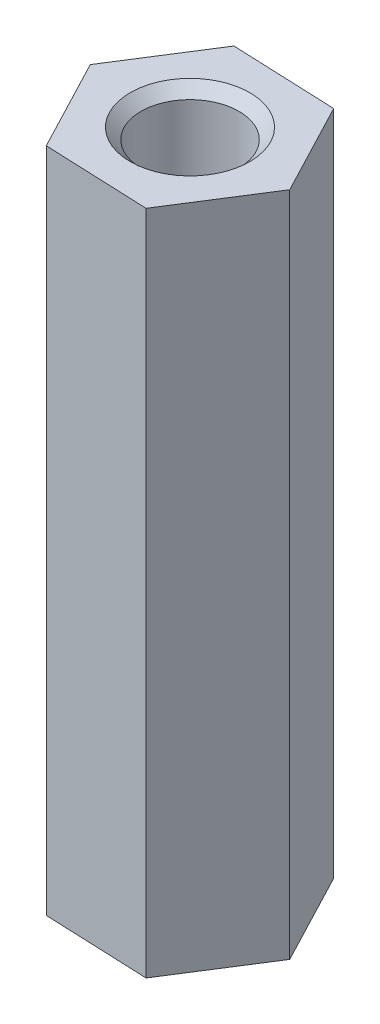
ISO-10303-21;
HEADER;
FILE_DESCRIPTION(('STEP AP214'),'2;1');
FILE_NAME('part.step','',(''),(''),'','','');
FILE_SCHEMA(('AUTOMOTIVE_DESIGN { 1 0 10303 214 1 1 1 1 }'));
ENDSEC;
DATA;
#1=APPLICATION_CONTEXT('core data for automotive mechanical design processes');
#2=APPLICATION_PROTOCOL_DEFINITION('international standard','automotive_design',2000,#1);
#3=PRODUCT_CONTEXT('',#1,'mechanical');
#4=PRODUCT('Part','Part','',(#3));
#5=PRODUCT_RELATED_PRODUCT_CATEGORY('part','',(#4));
#6=PRODUCT_DEFINITION_FORMATION('','',#4);
#7=PRODUCT_DEFINITION_CONTEXT('part definition',#1,'design');
#8=PRODUCT_DEFINITION('design','',#6,#7);
#9=PRODUCT_DEFINITION_SHAPE('','',#8);
#10=(LENGTH_UNIT() NAMED_UNIT(*) SI_UNIT(.MILLI.,.METRE.));
#11=(NAMED_UNIT(*) PLANE_ANGLE_UNIT() SI_UNIT($,.RADIAN.));
#12=(NAMED_UNIT(*) SI_UNIT($,.STERADIAN.) SOLID_ANGLE_UNIT());
#13=UNCERTAINTY_MEASURE_WITH_UNIT(LENGTH_MEASURE(1.E-05),#10,'distance_accuracy_value','');
#14=(GEOMETRIC_REPRESENTATION_CONTEXT(3) GLOBAL_UNCERTAINTY_ASSIGNED_CONTEXT((#13)) GLOBAL_UNIT_ASSIGNED_CONTEXT((#10,
#11,#12)) REPRESENTATION_CONTEXT('',''));
#15=CARTESIAN_POINT('',(0.,0.,0.));
#16=DIRECTION('',(0.,0.,1.));
#17=DIRECTION('',(1.,0.,0.));
#18=AXIS2_PLACEMENT_3D('',#15,#16,#17);
#19=CARTESIAN_POINT('',(0.,17.,0.));
#20=DIRECTION('',(0.,1.,0.));
#21=DIRECTION('',(0.,0.,1.));
#22=AXIS2_PLACEMENT_3D('',#19,#20,#21);
#23=PLANE('',#22);
#24=CARTESIAN_POINT('',(0.,17.,0.));
#25=DIRECTION('',(0.,1.,0.));
#26=DIRECTION('',(0.,0.,1.));
#27=AXIS2_PLACEMENT_3D('',#24,#25,#26);
#28=CIRCLE('',#27,1.525);
#29=CARTESIAN_POINT('',(0.,17.,1.525));
#30=VERTEX_POINT('',#29);
#31=EDGE_CURVE('E177',#30,#30,#28,.T.);
#32=ORIENTED_EDGE('',*,*,#31,.F.);
#33=EDGE_LOOP('',(#32));
#34=FACE_BOUND('',#33,.T.);
#35=DIRECTION('',(0.999145776971958,0.,0.0413245249107971));
#36=VECTOR('',#35,1.);
#37=CARTESIAN_POINT('',(-1.42181769887204,17.,2.24316021819832));
#38=LINE('',#37,#36);
#39=CARTESIAN_POINT('',(-1.42181769887204,17.,2.24316021819832));
#40=VERTEX_POINT('',#39);
#41=CARTESIAN_POINT('',(1.23172488428237,17.,2.35291035587268));
#42=VERTEX_POINT('',#41);
#43=EDGE_CURVE('E133',#40,#42,#38,.T.);
#44=ORIENTED_EDGE('',*,*,#43,.T.);
#45=DIRECTION('',(0.535360976858052,0.,-0.844623362486258));
#46=VECTOR('',#45,1.);
#47=CARTESIAN_POINT('',(1.23172488428237,17.,2.35291035587268));
#48=LINE('',#47,#46);
#49=CARTESIAN_POINT('',(2.65354258315441,17.,0.109750137674357));
#50=VERTEX_POINT('',#49);
#51=EDGE_CURVE('E92',#42,#50,#48,.T.);
#52=ORIENTED_EDGE('',*,*,#51,.T.);
#53=DIRECTION('',(-0.463784800113906,0.,-0.885947887397055));
#54=VECTOR('',#53,1.);
#55=CARTESIAN_POINT('',(2.65354258315441,17.,0.109750137674357));
#56=LINE('',#55,#54);
#57=CARTESIAN_POINT('',(1.42181769887204,17.,-2.24316021819832));
#58=VERTEX_POINT('',#57);
#59=EDGE_CURVE('E104',#50,#58,#56,.T.);
#60=ORIENTED_EDGE('',*,*,#59,.T.);
#61=DIRECTION('',(-0.999145776971957,0.,-0.0413245249107969));
#62=VECTOR('',#61,1.);
#63=CARTESIAN_POINT('',(1.42181769887204,17.,-2.24316021819832));
#64=LINE('',#63,#62);
#65=CARTESIAN_POINT('',(-1.23172488428237,17.,-2.35291035587268));
#66=VERTEX_POINT('',#65);
#67=EDGE_CURVE('E99',#58,#66,#64,.T.);
#68=ORIENTED_EDGE('',*,*,#67,.T.);
#69=DIRECTION('',(-0.535360976858052,0.,0.844623362486258));
#70=VECTOR('',#69,1.);
#71=CARTESIAN_POINT('',(-1.23172488428237,17.,-2.35291035587268));
#72=LINE('',#71,#70);
#73=CARTESIAN_POINT('',(-2.65354258315441,17.,-0.109750137674357));
#74=VERTEX_POINT('',#73);
#75=EDGE_CURVE('E102',#66,#74,#72,.T.);
#76=ORIENTED_EDGE('',*,*,#75,.T.);
#77=DIRECTION('',(0.463784800113906,0.,0.885947887397055));
#78=VECTOR('',#77,1.);
#79=CARTESIAN_POINT('',(-2.65354258315441,17.,-0.109750137674357));
#80=LINE('',#79,#78);
#81=EDGE_CURVE('E55',#74,#40,#80,.T.);
#82=ORIENTED_EDGE('',*,*,#81,.T.);
#83=EDGE_LOOP('',(#44,#52,#60,#68,#76,#82));
#84=FACE_BOUND('',#83,.T.);
#85=ADVANCED_FACE('F38',(#34,#84),#23,.T.);
#86=CARTESIAN_POINT('',(0.,0.,0.));
#87=DIRECTION('',(0.,1.,0.));
#88=DIRECTION('',(0.,0.,1.));
#89=AXIS2_PLACEMENT_3D('',#86,#87,#88);
#90=PLANE('',#89);
#91=CARTESIAN_POINT('',(0.,0.,0.));
#92=DIRECTION('',(0.,1.,0.));
#93=DIRECTION('',(0.,0.,1.));
#94=AXIS2_PLACEMENT_3D('',#91,#92,#93);
#95=CIRCLE('',#94,1.25);
#96=CARTESIAN_POINT('',(0.,0.,1.25));
#97=VERTEX_POINT('',#96);
#98=EDGE_CURVE('E126',#97,#97,#95,.T.);
#99=ORIENTED_EDGE('',*,*,#98,.T.);
#100=EDGE_LOOP('',(#99));
#101=FACE_BOUND('',#100,.T.);
#102=DIRECTION('',(0.999145776971958,0.,0.0413245249107971));
#103=VECTOR('',#102,1.);
#104=CARTESIAN_POINT('',(-1.42181769887204,0.,2.24316021819832));
#105=LINE('',#104,#103);
#106=CARTESIAN_POINT('',(-1.42181769887204,0.,2.24316021819832));
#107=VERTEX_POINT('',#106);
#108=CARTESIAN_POINT('',(1.23172488428237,0.,2.35291035587268));
#109=VERTEX_POINT('',#108);
#110=EDGE_CURVE('E122',#107,#109,#105,.T.);
#111=ORIENTED_EDGE('',*,*,#110,.F.);
#112=DIRECTION('',(0.463784800113906,0.,0.885947887397055));
#113=VECTOR('',#112,1.);
#114=CARTESIAN_POINT('',(-2.65354258315441,0.,-0.109750137674357));
#115=LINE('',#114,#113);
#116=CARTESIAN_POINT('',(-2.65354258315441,0.,-0.109750137674357));
#117=VERTEX_POINT('',#116);
#118=EDGE_CURVE('E84',#117,#107,#115,.T.);
#119=ORIENTED_EDGE('',*,*,#118,.F.);
#120=DIRECTION('',(-0.535360976858052,0.,0.844623362486258));
#121=VECTOR('',#120,1.);
#122=CARTESIAN_POINT('',(-1.23172488428237,0.,-2.35291035587268));
#123=LINE('',#122,#121);
#124=CARTESIAN_POINT('',(-1.23172488428237,0.,-2.35291035587268));
#125=VERTEX_POINT('',#124);
#126=EDGE_CURVE('E78',#125,#117,#123,.T.);
#127=ORIENTED_EDGE('',*,*,#126,.F.);
#128=DIRECTION('',(-0.999145776971957,0.,-0.0413245249107969));
#129=VECTOR('',#128,1.);
#130=CARTESIAN_POINT('',(1.42181769887204,0.,-2.24316021819832));
#131=LINE('',#130,#129);
#132=CARTESIAN_POINT('',(1.42181769887204,0.,-2.24316021819832));
#133=VERTEX_POINT('',#132);
#134=EDGE_CURVE('E112',#133,#125,#131,.T.);
#135=ORIENTED_EDGE('',*,*,#134,.F.);
#136=DIRECTION('',(-0.463784800113906,0.,-0.885947887397055));
#137=VECTOR('',#136,1.);
#138=CARTESIAN_POINT('',(2.65354258315441,0.,0.109750137674357));
#139=LINE('',#138,#137);
#140=CARTESIAN_POINT('',(2.65354258315441,0.,0.109750137674357));
#141=VERTEX_POINT('',#140);
#142=EDGE_CURVE('E128',#141,#133,#139,.T.);
#143=ORIENTED_EDGE('',*,*,#142,.F.);
#144=DIRECTION('',(0.535360976858052,0.,-0.844623362486258));
#145=VECTOR('',#144,1.);
#146=CARTESIAN_POINT('',(1.23172488428237,0.,2.35291035587268));
#147=LINE('',#146,#145);
#148=EDGE_CURVE('E125',#109,#141,#147,.T.);
#149=ORIENTED_EDGE('',*,*,#148,.F.);
#150=EDGE_LOOP('',(#111,#119,#127,#135,#143,#149));
#151=FACE_BOUND('',#150,.T.);
#152=ADVANCED_FACE('F142',(#101,#151),#90,.F.);
#153=CARTESIAN_POINT('',(-1.42181769887204,17.,2.24316021819832));
#154=DIRECTION('',(0.0413245249107971,0.,-0.999145776971958));
#155=DIRECTION('',(-0.999145776971958,0.,-0.0413245249107971));
#156=AXIS2_PLACEMENT_3D('',#153,#154,#155);
#157=PLANE('',#156);
#158=ORIENTED_EDGE('',*,*,#110,.T.);
#159=DIRECTION('',(0.,-1.,0.));
#160=VECTOR('',#159,1.);
#161=CARTESIAN_POINT('',(1.23172488428237,17.,2.35291035587268));
#162=LINE('',#161,#160);
#163=EDGE_CURVE('E11',#42,#109,#162,.T.);
#164=ORIENTED_EDGE('',*,*,#163,.F.);
#165=ORIENTED_EDGE('',*,*,#43,.F.);
#166=DIRECTION('',(0.,-1.,0.));
#167=VECTOR('',#166,1.);
#168=CARTESIAN_POINT('',(-1.42181769887204,17.,2.24316021819832));
#169=LINE('',#168,#167);
#170=EDGE_CURVE('E118',#40,#107,#169,.T.);
#171=ORIENTED_EDGE('',*,*,#170,.T.);
#172=EDGE_LOOP('',(#158,#164,#165,#171));
#173=FACE_BOUND('',#172,.T.);
#174=ADVANCED_FACE('F40',(#173),#157,.F.);
#175=CARTESIAN_POINT('',(1.23172488428237,17.,2.35291035587268));
#176=DIRECTION('',(-0.844623362486258,0.,-0.535360976858052));
#177=DIRECTION('',(-0.535360976858052,0.,0.844623362486258));
#178=AXIS2_PLACEMENT_3D('',#175,#176,#177);
#179=PLANE('',#178);
#180=ORIENTED_EDGE('',*,*,#148,.T.);
#181=DIRECTION('',(0.,-1.,0.));
#182=VECTOR('',#181,1.);
#183=CARTESIAN_POINT('',(2.65354258315441,17.,0.109750137674357));
#184=LINE('',#183,#182);
#185=EDGE_CURVE('E47',#50,#141,#184,.T.);
#186=ORIENTED_EDGE('',*,*,#185,.F.);
#187=ORIENTED_EDGE('',*,*,#51,.F.);
#188=ORIENTED_EDGE('',*,*,#163,.T.);
#189=EDGE_LOOP('',(#180,#186,#187,#188));
#190=FACE_BOUND('',#189,.T.);
#191=ADVANCED_FACE('F237',(#190),#179,.F.);
#192=CARTESIAN_POINT('',(2.65354258315441,17.,0.109750137674357));
#193=DIRECTION('',(-0.885947887397055,0.,0.463784800113906));
#194=DIRECTION('',(0.463784800113906,0.,0.885947887397055));
#195=AXIS2_PLACEMENT_3D('',#192,#193,#194);
#196=PLANE('',#195);
#197=ORIENTED_EDGE('',*,*,#142,.T.);
#198=DIRECTION('',(0.,-1.,0.));
#199=VECTOR('',#198,1.);
#200=CARTESIAN_POINT('',(1.42181769887204,17.,-2.24316021819832));
#201=LINE('',#200,#199);
#202=EDGE_CURVE('E113',#58,#133,#201,.T.);
#203=ORIENTED_EDGE('',*,*,#202,.F.);
#204=ORIENTED_EDGE('',*,*,#59,.F.);
#205=ORIENTED_EDGE('',*,*,#185,.T.);
#206=EDGE_LOOP('',(#197,#203,#204,#205));
#207=FACE_BOUND('',#206,.T.);
#208=ADVANCED_FACE('F139',(#207),#196,.F.);
#209=CARTESIAN_POINT('',(1.42181769887204,17.,-2.24316021819832));
#210=DIRECTION('',(-0.0413245249107969,0.,0.999145776971958));
#211=DIRECTION('',(0.999145776971958,0.,0.041324524910797));
#212=AXIS2_PLACEMENT_3D('',#209,#210,#211);
#213=PLANE('',#212);
#214=ORIENTED_EDGE('',*,*,#134,.T.);
#215=DIRECTION('',(0.,-1.,0.));
#216=VECTOR('',#215,1.);
#217=CARTESIAN_POINT('',(-1.23172488428237,17.,-2.35291035587268));
#218=LINE('',#217,#216);
#219=EDGE_CURVE('E109',#66,#125,#218,.T.);
#220=ORIENTED_EDGE('',*,*,#219,.F.);
#221=ORIENTED_EDGE('',*,*,#67,.F.);
#222=ORIENTED_EDGE('',*,*,#202,.T.);
#223=EDGE_LOOP('',(#214,#220,#221,#222));
#224=FACE_BOUND('',#223,.T.);
#225=ADVANCED_FACE('F110',(#224),#213,.F.);
#226=CARTESIAN_POINT('',(-1.23172488428237,17.,-2.35291035587268));
#227=DIRECTION('',(0.844623362486258,0.,0.535360976858052));
#228=DIRECTION('',(0.535360976858052,0.,-0.844623362486258));
#229=AXIS2_PLACEMENT_3D('',#226,#227,#228);
#230=PLANE('',#229);
#231=ORIENTED_EDGE('',*,*,#126,.T.);
#232=DIRECTION('',(0.,-1.,0.));
#233=VECTOR('',#232,1.);
#234=CARTESIAN_POINT('',(-2.65354258315441,17.,-0.109750137674357));
#235=LINE('',#234,#233);
#236=EDGE_CURVE('E114',#74,#117,#235,.T.);
#237=ORIENTED_EDGE('',*,*,#236,.F.);
#238=ORIENTED_EDGE('',*,*,#75,.F.);
#239=ORIENTED_EDGE('',*,*,#219,.T.);
#240=EDGE_LOOP('',(#231,#237,#238,#239));
#241=FACE_BOUND('',#240,.T.);
#242=ADVANCED_FACE('F116',(#241),#230,.F.);
#243=CARTESIAN_POINT('',(-2.65354258315441,17.,-0.109750137674357));
#244=DIRECTION('',(0.885947887397055,0.,-0.463784800113906));
#245=DIRECTION('',(-0.463784800113906,0.,-0.885947887397055));
#246=AXIS2_PLACEMENT_3D('',#243,#244,#245);
#247=PLANE('',#246);
#248=ORIENTED_EDGE('',*,*,#118,.T.);
#249=ORIENTED_EDGE('',*,*,#170,.F.);
#250=ORIENTED_EDGE('',*,*,#81,.F.);
#251=ORIENTED_EDGE('',*,*,#236,.T.);
#252=EDGE_LOOP('',(#248,#249,#250,#251));
#253=FACE_BOUND('',#252,.T.);
#254=ADVANCED_FACE('F146',(#253),#247,.F.);
#255=CARTESIAN_POINT('',(0.,17.,0.));
#256=DIRECTION('',(0.,1.,0.));
#257=DIRECTION('',(0.,0.,1.));
#258=AXIS2_PLACEMENT_3D('',#255,#256,#257);
#259=CYLINDRICAL_SURFACE('',#258,1.25);
#260=ORIENTED_EDGE('',*,*,#98,.F.);
#261=EDGE_LOOP('',(#260));
#262=FACE_BOUND('',#261,.T.);
#263=CARTESIAN_POINT('',(0.,16.725,0.));
#264=DIRECTION('',(0.,1.,0.));
#265=DIRECTION('',(0.,0.,1.));
#266=AXIS2_PLACEMENT_3D('',#263,#264,#265);
#267=CIRCLE('',#266,1.25);
#268=CARTESIAN_POINT('',(0.,16.725,1.25));
#269=VERTEX_POINT('',#268);
#270=EDGE_CURVE('E175',#269,#269,#267,.T.);
#271=ORIENTED_EDGE('',*,*,#270,.T.);
#272=EDGE_LOOP('',(#271));
#273=FACE_BOUND('',#272,.T.);
#274=ADVANCED_FACE('F148',(#262,#273),#259,.F.);
#275=CARTESIAN_POINT('',(0.,17.,0.));
#276=DIRECTION('',(0.,1.,0.));
#277=DIRECTION('',(0.,0.,1.));
#278=AXIS2_PLACEMENT_3D('',#275,#276,#277);
#279=CONICAL_SURFACE('',#278,1.525,0.785398163397445);
#280=ORIENTED_EDGE('',*,*,#270,.F.);
#281=EDGE_LOOP('',(#280));
#282=FACE_BOUND('',#281,.T.);
#283=ORIENTED_EDGE('',*,*,#31,.T.);
#284=EDGE_LOOP('',(#283));
#285=FACE_BOUND('',#284,.T.);
#286=ADVANCED_FACE('F154',(#282,#285),#279,.F.);
#287=CLOSED_SHELL('',(#85,#152,#174,#191,#208,#225,#242,#254,#274,#286));
#288=MANIFOLD_SOLID_BREP('B2',#287);
#289=ADVANCED_BREP_SHAPE_REPRESENTATION('',(#18,#288),#14);
#290=SHAPE_DEFINITION_REPRESENTATION(#9,#289);
ENDSEC;
END-ISO-10303-21;
